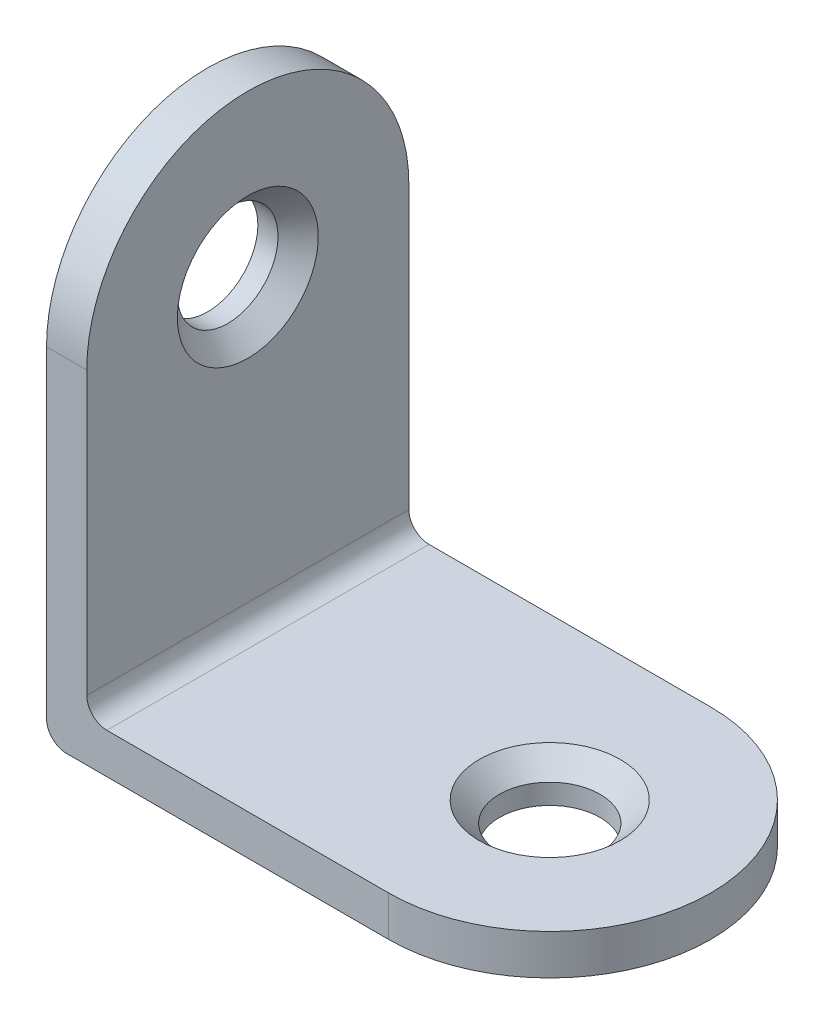
ISO-10303-21;
HEADER;
FILE_DESCRIPTION(('STEP AP214'),'2;1');
FILE_NAME('part.step','',(''),(''),'','','');
FILE_SCHEMA(('AUTOMOTIVE_DESIGN { 1 0 10303 214 1 1 1 1 }'));
ENDSEC;
DATA;
#1=APPLICATION_CONTEXT('core data for automotive mechanical design processes');
#2=APPLICATION_PROTOCOL_DEFINITION('international standard','automotive_design',2000,#1);
#3=PRODUCT_CONTEXT('',#1,'mechanical');
#4=PRODUCT('Part','Part','',(#3));
#5=PRODUCT_RELATED_PRODUCT_CATEGORY('part','',(#4));
#6=PRODUCT_DEFINITION_FORMATION('','',#4);
#7=PRODUCT_DEFINITION_CONTEXT('part definition',#1,'design');
#8=PRODUCT_DEFINITION('design','',#6,#7);
#9=PRODUCT_DEFINITION_SHAPE('','',#8);
#10=(LENGTH_UNIT() NAMED_UNIT(*) SI_UNIT(.MILLI.,.METRE.));
#11=(NAMED_UNIT(*) PLANE_ANGLE_UNIT() SI_UNIT($,.RADIAN.));
#12=(NAMED_UNIT(*) SI_UNIT($,.STERADIAN.) SOLID_ANGLE_UNIT());
#13=UNCERTAINTY_MEASURE_WITH_UNIT(LENGTH_MEASURE(1.E-05),#10,'distance_accuracy_value','');
#14=(GEOMETRIC_REPRESENTATION_CONTEXT(3) GLOBAL_UNCERTAINTY_ASSIGNED_CONTEXT((#13)) GLOBAL_UNIT_ASSIGNED_CONTEXT((#10,
#11,#12)) REPRESENTATION_CONTEXT('',''));
#15=CARTESIAN_POINT('',(0.,0.,0.));
#16=DIRECTION('',(0.,0.,1.));
#17=DIRECTION('',(1.,0.,0.));
#18=AXIS2_PLACEMENT_3D('',#15,#16,#17);
#19=CARTESIAN_POINT('',(23.,0.,16.));
#20=DIRECTION('',(0.,-1.,0.));
#21=DIRECTION('',(1.,0.,0.));
#22=AXIS2_PLACEMENT_3D('',#19,#20,#21);
#23=PLANE('',#22);
#24=CARTESIAN_POINT('',(15.,0.,8.));
#25=DIRECTION('',(0.,-1.,0.));
#26=DIRECTION('',(1.,0.,0.));
#27=AXIS2_PLACEMENT_3D('',#24,#25,#26);
#28=CIRCLE('',#27,3.50000000000001);
#29=CARTESIAN_POINT('',(18.5,0.,8.));
#30=VERTEX_POINT('',#29);
#31=EDGE_CURVE('E11',#30,#30,#28,.T.);
#32=ORIENTED_EDGE('',*,*,#31,.T.);
#33=EDGE_LOOP('',(#32));
#34=FACE_BOUND('',#33,.T.);
#35=DIRECTION('',(-1.,0.,0.));
#36=VECTOR('',#35,1.);
#37=CARTESIAN_POINT('',(23.,0.,0.));
#38=LINE('',#37,#36);
#39=CARTESIAN_POINT('',(15.,0.,0.));
#40=VERTEX_POINT('',#39);
#41=CARTESIAN_POINT('',(1.,0.,0.));
#42=VERTEX_POINT('',#41);
#43=EDGE_CURVE('E153',#40,#42,#38,.T.);
#44=ORIENTED_EDGE('',*,*,#43,.T.);
#45=DIRECTION('',(0.,0.,-1.));
#46=VECTOR('',#45,1.);
#47=CARTESIAN_POINT('',(1.,0.,16.));
#48=LINE('',#47,#46);
#49=CARTESIAN_POINT('',(1.,0.,16.));
#50=VERTEX_POINT('',#49);
#51=EDGE_CURVE('E136',#42,#50,#48,.F.);
#52=ORIENTED_EDGE('',*,*,#51,.T.);
#53=DIRECTION('',(-1.,0.,0.));
#54=VECTOR('',#53,1.);
#55=CARTESIAN_POINT('',(23.,0.,16.));
#56=LINE('',#55,#54);
#57=CARTESIAN_POINT('',(15.,0.,16.));
#58=VERTEX_POINT('',#57);
#59=EDGE_CURVE('E126',#58,#50,#56,.T.);
#60=ORIENTED_EDGE('',*,*,#59,.F.);
#61=CARTESIAN_POINT('',(15.,0.,8.));
#62=DIRECTION('',(0.,-1.,0.));
#63=DIRECTION('',(1.,0.,0.));
#64=AXIS2_PLACEMENT_3D('',#61,#62,#63);
#65=CIRCLE('',#64,8.);
#66=EDGE_CURVE('E108',#40,#58,#65,.T.);
#67=ORIENTED_EDGE('',*,*,#66,.F.);
#68=EDGE_LOOP('',(#44,#52,#60,#67));
#69=FACE_BOUND('',#68,.T.);
#70=ADVANCED_FACE('F40',(#34,#69),#23,.F.);
#71=CARTESIAN_POINT('',(-2.,-2.,16.));
#72=DIRECTION('',(0.,1.,0.));
#73=DIRECTION('',(-1.,0.,0.));
#74=AXIS2_PLACEMENT_3D('',#71,#72,#73);
#75=PLANE('',#74);
#76=CARTESIAN_POINT('',(15.,-1.99999999999999,8.));
#77=DIRECTION('',(0.,1.,0.));
#78=DIRECTION('',(-1.,0.,0.));
#79=AXIS2_PLACEMENT_3D('',#76,#77,#78);
#80=CIRCLE('',#79,2.5);
#81=CARTESIAN_POINT('',(12.5,-1.99999999999999,8.));
#82=VERTEX_POINT('',#81);
#83=EDGE_CURVE('E172',#82,#82,#80,.T.);
#84=ORIENTED_EDGE('',*,*,#83,.T.);
#85=EDGE_LOOP('',(#84));
#86=FACE_BOUND('',#85,.T.);
#87=DIRECTION('',(1.,0.,0.));
#88=VECTOR('',#87,1.);
#89=CARTESIAN_POINT('',(-2.,-2.,16.));
#90=LINE('',#89,#88);
#91=CARTESIAN_POINT('',(-1.,-2.,16.));
#92=VERTEX_POINT('',#91);
#93=CARTESIAN_POINT('',(15.,-1.99999999999999,16.));
#94=VERTEX_POINT('',#93);
#95=EDGE_CURVE('E129',#92,#94,#90,.T.);
#96=ORIENTED_EDGE('',*,*,#95,.F.);
#97=DIRECTION('',(0.,0.,-1.));
#98=VECTOR('',#97,1.);
#99=CARTESIAN_POINT('',(-1.,-2.,16.));
#100=LINE('',#99,#98);
#101=CARTESIAN_POINT('',(-1.,-2.,0.));
#102=VERTEX_POINT('',#101);
#103=EDGE_CURVE('E191',#92,#102,#100,.T.);
#104=ORIENTED_EDGE('',*,*,#103,.T.);
#105=DIRECTION('',(1.,0.,0.));
#106=VECTOR('',#105,1.);
#107=CARTESIAN_POINT('',(-2.,-2.,0.));
#108=LINE('',#107,#106);
#109=CARTESIAN_POINT('',(15.,-1.99999999999999,0.));
#110=VERTEX_POINT('',#109);
#111=EDGE_CURVE('E139',#102,#110,#108,.T.);
#112=ORIENTED_EDGE('',*,*,#111,.T.);
#113=CARTESIAN_POINT('',(15.,-1.99999999999999,8.));
#114=DIRECTION('',(0.,-1.,0.));
#115=DIRECTION('',(1.,0.,0.));
#116=AXIS2_PLACEMENT_3D('',#113,#114,#115);
#117=CIRCLE('',#116,8.);
#118=EDGE_CURVE('E121',#110,#94,#117,.T.);
#119=ORIENTED_EDGE('',*,*,#118,.T.);
#120=EDGE_LOOP('',(#96,#104,#112,#119));
#121=FACE_BOUND('',#120,.T.);
#122=ADVANCED_FACE('F226',(#86,#121),#75,.F.);
#123=CARTESIAN_POINT('',(0.,0.,16.));
#124=DIRECTION('',(0.,0.,-1.));
#125=DIRECTION('',(-1.,0.,0.));
#126=AXIS2_PLACEMENT_3D('',#123,#124,#125);
#127=PLANE('',#126);
#128=DIRECTION('',(0.,-1.,0.));
#129=VECTOR('',#128,1.);
#130=CARTESIAN_POINT('',(-2.,23.,16.));
#131=LINE('',#130,#129);
#132=CARTESIAN_POINT('',(-2.,15.,16.));
#133=VERTEX_POINT('',#132);
#134=CARTESIAN_POINT('',(-2.,-0.999999999999994,16.));
#135=VERTEX_POINT('',#134);
#136=EDGE_CURVE('E143',#133,#135,#131,.T.);
#137=ORIENTED_EDGE('',*,*,#136,.T.);
#138=CARTESIAN_POINT('',(-1.,-0.999999999999996,16.));
#139=DIRECTION('',(0.,0.,-1.));
#140=DIRECTION('',(-1.,0.,0.));
#141=AXIS2_PLACEMENT_3D('',#138,#139,#140);
#142=CIRCLE('',#141,1.);
#143=EDGE_CURVE('E199',#135,#92,#142,.F.);
#144=ORIENTED_EDGE('',*,*,#143,.T.);
#145=ORIENTED_EDGE('',*,*,#95,.T.);
#146=DIRECTION('',(0.,-1.,0.));
#147=VECTOR('',#146,1.);
#148=CARTESIAN_POINT('',(15.,14.,16.));
#149=LINE('',#148,#147);
#150=EDGE_CURVE('E112',#58,#94,#149,.T.);
#151=ORIENTED_EDGE('',*,*,#150,.F.);
#152=ORIENTED_EDGE('',*,*,#59,.T.);
#153=CARTESIAN_POINT('',(1.,1.,16.));
#154=DIRECTION('',(0.,0.,-1.));
#155=DIRECTION('',(-1.,0.,0.));
#156=AXIS2_PLACEMENT_3D('',#153,#154,#155);
#157=CIRCLE('',#156,1.);
#158=CARTESIAN_POINT('',(0.,1.,16.));
#159=VERTEX_POINT('',#158);
#160=EDGE_CURVE('E188',#50,#159,#157,.T.);
#161=ORIENTED_EDGE('',*,*,#160,.T.);
#162=DIRECTION('',(0.,1.,0.));
#163=VECTOR('',#162,1.);
#164=CARTESIAN_POINT('',(0.,0.,16.));
#165=LINE('',#164,#163);
#166=CARTESIAN_POINT('',(0.,15.,16.));
#167=VERTEX_POINT('',#166);
#168=EDGE_CURVE('E138',#159,#167,#165,.T.);
#169=ORIENTED_EDGE('',*,*,#168,.T.);
#170=DIRECTION('',(-1.,0.,0.));
#171=VECTOR('',#170,1.);
#172=CARTESIAN_POINT('',(23.,15.,16.));
#173=LINE('',#172,#171);
#174=EDGE_CURVE('E161',#133,#167,#173,.F.);
#175=ORIENTED_EDGE('',*,*,#174,.F.);
#176=EDGE_LOOP('',(#137,#144,#145,#151,#152,#161,#169,#175));
#177=FACE_BOUND('',#176,.T.);
#178=ADVANCED_FACE('F125',(#177),#127,.F.);
#179=CARTESIAN_POINT('',(0.,0.,0.));
#180=DIRECTION('',(0.,0.,-1.));
#181=DIRECTION('',(-1.,0.,0.));
#182=AXIS2_PLACEMENT_3D('',#179,#180,#181);
#183=PLANE('',#182);
#184=ORIENTED_EDGE('',*,*,#111,.F.);
#185=CARTESIAN_POINT('',(-1.,-0.999999999999996,0.));
#186=DIRECTION('',(0.,0.,-1.));
#187=DIRECTION('',(-1.,0.,0.));
#188=AXIS2_PLACEMENT_3D('',#185,#186,#187);
#189=CIRCLE('',#188,1.);
#190=CARTESIAN_POINT('',(-2.,-0.999999999999994,0.));
#191=VERTEX_POINT('',#190);
#192=EDGE_CURVE('E64',#102,#191,#189,.T.);
#193=ORIENTED_EDGE('',*,*,#192,.T.);
#194=DIRECTION('',(0.,-1.,0.));
#195=VECTOR('',#194,1.);
#196=CARTESIAN_POINT('',(-2.,23.,0.));
#197=LINE('',#196,#195);
#198=CARTESIAN_POINT('',(-2.,15.,0.));
#199=VERTEX_POINT('',#198);
#200=EDGE_CURVE('E145',#199,#191,#197,.T.);
#201=ORIENTED_EDGE('',*,*,#200,.F.);
#202=DIRECTION('',(1.,0.,0.));
#203=VECTOR('',#202,1.);
#204=CARTESIAN_POINT('',(-16.,15.,0.));
#205=LINE('',#204,#203);
#206=CARTESIAN_POINT('',(0.,15.,0.));
#207=VERTEX_POINT('',#206);
#208=EDGE_CURVE('E133',#199,#207,#205,.T.);
#209=ORIENTED_EDGE('',*,*,#208,.T.);
#210=DIRECTION('',(0.,1.,0.));
#211=VECTOR('',#210,1.);
#212=CARTESIAN_POINT('',(0.,0.,0.));
#213=LINE('',#212,#211);
#214=CARTESIAN_POINT('',(0.,1.,0.));
#215=VERTEX_POINT('',#214);
#216=EDGE_CURVE('E156',#215,#207,#213,.T.);
#217=ORIENTED_EDGE('',*,*,#216,.F.);
#218=CARTESIAN_POINT('',(1.,1.,0.));
#219=DIRECTION('',(0.,0.,-1.));
#220=DIRECTION('',(-1.,0.,0.));
#221=AXIS2_PLACEMENT_3D('',#218,#219,#220);
#222=CIRCLE('',#221,1.);
#223=EDGE_CURVE('E185',#215,#42,#222,.F.);
#224=ORIENTED_EDGE('',*,*,#223,.T.);
#225=ORIENTED_EDGE('',*,*,#43,.F.);
#226=DIRECTION('',(0.,-1.,0.));
#227=VECTOR('',#226,1.);
#228=CARTESIAN_POINT('',(15.,14.,0.));
#229=LINE('',#228,#227);
#230=EDGE_CURVE('E114',#40,#110,#229,.T.);
#231=ORIENTED_EDGE('',*,*,#230,.T.);
#232=EDGE_LOOP('',(#184,#193,#201,#209,#217,#224,#225,#231));
#233=FACE_BOUND('',#232,.T.);
#234=ADVANCED_FACE('F253',(#233),#183,.T.);
#235=CARTESIAN_POINT('',(0.,0.,16.));
#236=DIRECTION('',(-1.,0.,0.));
#237=DIRECTION('',(0.,-1.,0.));
#238=AXIS2_PLACEMENT_3D('',#235,#236,#237);
#239=PLANE('',#238);
#240=CARTESIAN_POINT('',(0.,15.,8.));
#241=DIRECTION('',(-1.,0.,0.));
#242=DIRECTION('',(0.,-1.,0.));
#243=AXIS2_PLACEMENT_3D('',#240,#241,#242);
#244=CIRCLE('',#243,3.50000000000001);
#245=CARTESIAN_POINT('',(0.,11.5,8.));
#246=VERTEX_POINT('',#245);
#247=EDGE_CURVE('E206',#246,#246,#244,.T.);
#248=ORIENTED_EDGE('',*,*,#247,.T.);
#249=EDGE_LOOP('',(#248));
#250=FACE_BOUND('',#249,.T.);
#251=ORIENTED_EDGE('',*,*,#168,.F.);
#252=DIRECTION('',(0.,0.,-1.));
#253=VECTOR('',#252,1.);
#254=CARTESIAN_POINT('',(0.,1.,0.));
#255=LINE('',#254,#253);
#256=EDGE_CURVE('E132',#159,#215,#255,.T.);
#257=ORIENTED_EDGE('',*,*,#256,.T.);
#258=ORIENTED_EDGE('',*,*,#216,.T.);
#259=CARTESIAN_POINT('',(0.,15.,8.));
#260=DIRECTION('',(-1.,0.,0.));
#261=DIRECTION('',(0.,-1.,0.));
#262=AXIS2_PLACEMENT_3D('',#259,#260,#261);
#263=CIRCLE('',#262,8.);
#264=EDGE_CURVE('E148',#207,#167,#263,.F.);
#265=ORIENTED_EDGE('',*,*,#264,.T.);
#266=EDGE_LOOP('',(#251,#257,#258,#265));
#267=FACE_BOUND('',#266,.T.);
#268=ADVANCED_FACE('F238',(#250,#267),#239,.F.);
#269=CARTESIAN_POINT('',(-2.,23.,16.));
#270=DIRECTION('',(1.,0.,0.));
#271=DIRECTION('',(0.,1.,0.));
#272=AXIS2_PLACEMENT_3D('',#269,#270,#271);
#273=PLANE('',#272);
#274=CARTESIAN_POINT('',(-2.,15.,8.));
#275=DIRECTION('',(1.,0.,0.));
#276=DIRECTION('',(0.,1.,0.));
#277=AXIS2_PLACEMENT_3D('',#274,#275,#276);
#278=CIRCLE('',#277,2.5);
#279=CARTESIAN_POINT('',(-2.,17.5,8.));
#280=VERTEX_POINT('',#279);
#281=EDGE_CURVE('E176',#280,#280,#278,.T.);
#282=ORIENTED_EDGE('',*,*,#281,.T.);
#283=EDGE_LOOP('',(#282));
#284=FACE_BOUND('',#283,.T.);
#285=ORIENTED_EDGE('',*,*,#200,.T.);
#286=DIRECTION('',(0.,0.,-1.));
#287=VECTOR('',#286,1.);
#288=CARTESIAN_POINT('',(-2.,-0.999999999999994,16.));
#289=LINE('',#288,#287);
#290=EDGE_CURVE('E56',#191,#135,#289,.F.);
#291=ORIENTED_EDGE('',*,*,#290,.T.);
#292=ORIENTED_EDGE('',*,*,#136,.F.);
#293=CARTESIAN_POINT('',(-2.,15.,8.));
#294=DIRECTION('',(1.,0.,0.));
#295=DIRECTION('',(0.,1.,0.));
#296=AXIS2_PLACEMENT_3D('',#293,#294,#295);
#297=CIRCLE('',#296,8.);
#298=EDGE_CURVE('E120',#133,#199,#297,.F.);
#299=ORIENTED_EDGE('',*,*,#298,.T.);
#300=EDGE_LOOP('',(#285,#291,#292,#299));
#301=FACE_BOUND('',#300,.T.);
#302=ADVANCED_FACE('F267',(#284,#301),#273,.F.);
#303=CARTESIAN_POINT('',(23.,15.,8.));
#304=DIRECTION('',(-1.,0.,0.));
#305=DIRECTION('',(0.,0.,1.));
#306=AXIS2_PLACEMENT_3D('',#303,#304,#305);
#307=CYLINDRICAL_SURFACE('',#306,8.);
#308=ORIENTED_EDGE('',*,*,#264,.F.);
#309=ORIENTED_EDGE('',*,*,#208,.F.);
#310=ORIENTED_EDGE('',*,*,#298,.F.);
#311=ORIENTED_EDGE('',*,*,#174,.T.);
#312=EDGE_LOOP('',(#308,#309,#310,#311));
#313=FACE_BOUND('',#312,.T.);
#314=ADVANCED_FACE('F266',(#313),#307,.T.);
#315=CARTESIAN_POINT('',(15.,14.,8.));
#316=DIRECTION('',(0.,-1.,0.));
#317=DIRECTION('',(1.,0.,0.));
#318=AXIS2_PLACEMENT_3D('',#315,#316,#317);
#319=CYLINDRICAL_SURFACE('',#318,8.);
#320=ORIENTED_EDGE('',*,*,#66,.T.);
#321=ORIENTED_EDGE('',*,*,#150,.T.);
#322=ORIENTED_EDGE('',*,*,#118,.F.);
#323=ORIENTED_EDGE('',*,*,#230,.F.);
#324=EDGE_LOOP('',(#320,#321,#322,#323));
#325=FACE_BOUND('',#324,.T.);
#326=ADVANCED_FACE('F110',(#325),#319,.T.);
#327=CARTESIAN_POINT('',(15.,-16.,8.));
#328=DIRECTION('',(0.,1.,0.));
#329=DIRECTION('',(-1.,0.,0.));
#330=AXIS2_PLACEMENT_3D('',#327,#328,#329);
#331=CYLINDRICAL_SURFACE('',#330,2.5);
#332=CARTESIAN_POINT('',(15.,-0.999999999999999,8.));
#333=DIRECTION('',(0.,-1.,0.));
#334=DIRECTION('',(0.,0.,-1.));
#335=AXIS2_PLACEMENT_3D('',#332,#333,#334);
#336=CIRCLE('',#335,2.5);
#337=CARTESIAN_POINT('',(15.,-0.999999999999999,5.5));
#338=VERTEX_POINT('',#337);
#339=EDGE_CURVE('E49',#338,#338,#336,.F.);
#340=ORIENTED_EDGE('',*,*,#339,.T.);
#341=EDGE_LOOP('',(#340));
#342=FACE_BOUND('',#341,.T.);
#343=ORIENTED_EDGE('',*,*,#83,.F.);
#344=EDGE_LOOP('',(#343));
#345=FACE_BOUND('',#344,.T.);
#346=ADVANCED_FACE('F213',(#342,#345),#331,.F.);
#347=CARTESIAN_POINT('',(-16.,15.,8.));
#348=DIRECTION('',(1.,0.,0.));
#349=DIRECTION('',(0.,0.,-1.));
#350=AXIS2_PLACEMENT_3D('',#347,#348,#349);
#351=CYLINDRICAL_SURFACE('',#350,2.5);
#352=CARTESIAN_POINT('',(-1.00000000000001,15.,8.));
#353=DIRECTION('',(-1.,0.,0.));
#354=DIRECTION('',(0.,0.,1.));
#355=AXIS2_PLACEMENT_3D('',#352,#353,#354);
#356=CIRCLE('',#355,2.5);
#357=CARTESIAN_POINT('',(-1.00000000000001,15.,10.5));
#358=VERTEX_POINT('',#357);
#359=EDGE_CURVE('E202',#358,#358,#356,.F.);
#360=ORIENTED_EDGE('',*,*,#359,.T.);
#361=EDGE_LOOP('',(#360));
#362=FACE_BOUND('',#361,.T.);
#363=ORIENTED_EDGE('',*,*,#281,.F.);
#364=EDGE_LOOP('',(#363));
#365=FACE_BOUND('',#364,.T.);
#366=ADVANCED_FACE('F243',(#362,#365),#351,.F.);
#367=CARTESIAN_POINT('',(1.,1.,16.));
#368=DIRECTION('',(0.,0.,1.));
#369=DIRECTION('',(1.,0.,0.));
#370=AXIS2_PLACEMENT_3D('',#367,#368,#369);
#371=CYLINDRICAL_SURFACE('',#370,1.);
#372=ORIENTED_EDGE('',*,*,#160,.F.);
#373=ORIENTED_EDGE('',*,*,#51,.F.);
#374=ORIENTED_EDGE('',*,*,#223,.F.);
#375=ORIENTED_EDGE('',*,*,#256,.F.);
#376=EDGE_LOOP('',(#372,#373,#374,#375));
#377=FACE_BOUND('',#376,.T.);
#378=ADVANCED_FACE('F240',(#377),#371,.F.);
#379=CARTESIAN_POINT('',(-1.,-0.999999999999996,16.));
#380=DIRECTION('',(0.,0.,-1.));
#381=DIRECTION('',(-1.,0.,0.));
#382=AXIS2_PLACEMENT_3D('',#379,#380,#381);
#383=CYLINDRICAL_SURFACE('',#382,1.);
#384=ORIENTED_EDGE('',*,*,#143,.F.);
#385=ORIENTED_EDGE('',*,*,#290,.F.);
#386=ORIENTED_EDGE('',*,*,#192,.F.);
#387=ORIENTED_EDGE('',*,*,#103,.F.);
#388=EDGE_LOOP('',(#384,#385,#386,#387));
#389=FACE_BOUND('',#388,.T.);
#390=ADVANCED_FACE('F222',(#389),#383,.T.);
#391=CARTESIAN_POINT('',(-1.00000000000001,15.,8.));
#392=DIRECTION('',(1.,0.,0.));
#393=DIRECTION('',(0.,0.,-1.));
#394=AXIS2_PLACEMENT_3D('',#391,#392,#393);
#395=CONICAL_SURFACE('',#394,2.5,0.785398163397451);
#396=ORIENTED_EDGE('',*,*,#247,.F.);
#397=EDGE_LOOP('',(#396));
#398=FACE_BOUND('',#397,.T.);
#399=ORIENTED_EDGE('',*,*,#359,.F.);
#400=EDGE_LOOP('',(#399));
#401=FACE_BOUND('',#400,.T.);
#402=ADVANCED_FACE('F217',(#398,#401),#395,.F.);
#403=CARTESIAN_POINT('',(15.,-0.999999999999999,8.));
#404=DIRECTION('',(0.,1.,0.));
#405=DIRECTION('',(0.,0.,1.));
#406=AXIS2_PLACEMENT_3D('',#403,#404,#405);
#407=CONICAL_SURFACE('',#406,2.5,0.785398163397451);
#408=ORIENTED_EDGE('',*,*,#31,.F.);
#409=EDGE_LOOP('',(#408));
#410=FACE_BOUND('',#409,.T.);
#411=ORIENTED_EDGE('',*,*,#339,.F.);
#412=EDGE_LOOP('',(#411));
#413=FACE_BOUND('',#412,.T.);
#414=ADVANCED_FACE('F42',(#410,#413),#407,.F.);
#415=CLOSED_SHELL('',(#70,#122,#178,#234,#268,#302,#314,#326,#346,#366,#378,#390,#402,#414));
#416=MANIFOLD_SOLID_BREP('B2',#415);
#417=ADVANCED_BREP_SHAPE_REPRESENTATION('',(#18,#416),#14);
#418=SHAPE_DEFINITION_REPRESENTATION(#9,#417);
ENDSEC;
END-ISO-10303-21;
